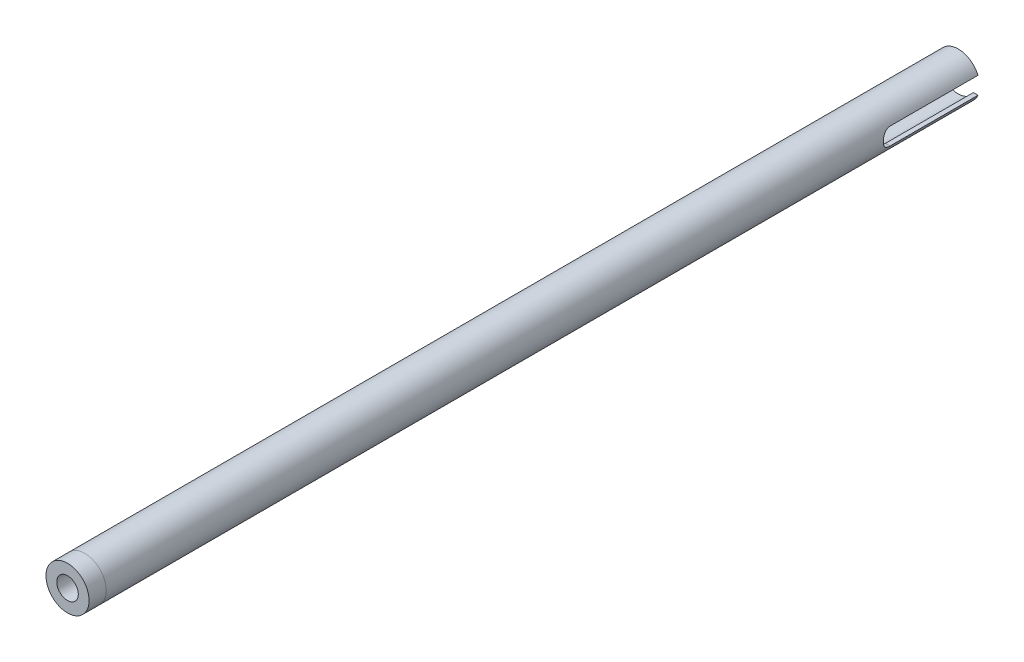
ISO-10303-21;
HEADER;
FILE_DESCRIPTION(('STEP AP214'),'2;1');
FILE_NAME('part.step','',(''),(''),'','','');
FILE_SCHEMA(('AUTOMOTIVE_DESIGN { 1 0 10303 214 1 1 1 1 }'));
ENDSEC;
DATA;
#1=APPLICATION_CONTEXT('core data for automotive mechanical design processes');
#2=APPLICATION_PROTOCOL_DEFINITION('international standard','automotive_design',2000,#1);
#3=PRODUCT_CONTEXT('',#1,'mechanical');
#4=PRODUCT('Part','Part','',(#3));
#5=PRODUCT_RELATED_PRODUCT_CATEGORY('part','',(#4));
#6=PRODUCT_DEFINITION_FORMATION('','',#4);
#7=PRODUCT_DEFINITION_CONTEXT('part definition',#1,'design');
#8=PRODUCT_DEFINITION('design','',#6,#7);
#9=PRODUCT_DEFINITION_SHAPE('','',#8);
#10=(LENGTH_UNIT() NAMED_UNIT(*) SI_UNIT(.MILLI.,.METRE.));
#11=(NAMED_UNIT(*) PLANE_ANGLE_UNIT() SI_UNIT($,.RADIAN.));
#12=(NAMED_UNIT(*) SI_UNIT($,.STERADIAN.) SOLID_ANGLE_UNIT());
#13=UNCERTAINTY_MEASURE_WITH_UNIT(LENGTH_MEASURE(1.E-05),#10,'distance_accuracy_value','');
#14=(GEOMETRIC_REPRESENTATION_CONTEXT(3) GLOBAL_UNCERTAINTY_ASSIGNED_CONTEXT((#13)) GLOBAL_UNIT_ASSIGNED_CONTEXT((#10,
#11,#12)) REPRESENTATION_CONTEXT('',''));
#15=CARTESIAN_POINT('',(0.,0.,0.));
#16=DIRECTION('',(0.,0.,1.));
#17=DIRECTION('',(1.,0.,0.));
#18=AXIS2_PLACEMENT_3D('',#15,#16,#17);
#19=CARTESIAN_POINT('',(0.,0.,-328.070249741068));
#20=DIRECTION('',(0.,0.,1.));
#21=DIRECTION('',(1.,0.,0.));
#22=AXIS2_PLACEMENT_3D('',#19,#20,#21);
#23=CYLINDRICAL_SURFACE('',#22,7.9375);
#24=CARTESIAN_POINT('',(0.,0.,-6.35));
#25=DIRECTION('',(0.,0.,1.));
#26=DIRECTION('',(1.,0.,0.));
#27=AXIS2_PLACEMENT_3D('',#24,#25,#26);
#28=CIRCLE('',#27,7.9375);
#29=CARTESIAN_POINT('',(7.9375,0.,-6.35));
#30=VERTEX_POINT('',#29);
#31=EDGE_CURVE('E167',#30,#30,#28,.T.);
#32=ORIENTED_EDGE('',*,*,#31,.F.);
#33=EDGE_LOOP('',(#32));
#34=FACE_BOUND('',#33,.T.);
#35=CARTESIAN_POINT('',(-7.2748389157424,3.175,-295.685249741068));
#36=CARTESIAN_POINT('',(-7.27482137043434,3.17501267173453,-295.599829625585));
#37=CARTESIAN_POINT('',(-7.27634297592672,3.17155313247793,-295.514419096022));
#38=CARTESIAN_POINT('',(-7.28233338484875,3.15778866907725,-295.344287091694));
#39=CARTESIAN_POINT('',(-7.28680106535325,3.14748635311323,-295.259565366835));
#40=CARTESIAN_POINT('',(-7.2985291631267,3.12019002880163,-295.091751667027));
#41=CARTESIAN_POINT('',(-7.30577831906487,3.10322299732752,-295.008654522267));
#42=CARTESIAN_POINT('',(-7.32282161153744,3.06278779397035,-294.844343420242));
#43=CARTESIAN_POINT('',(-7.33261590324725,3.03931922568674,-294.763129578129));
#44=CARTESIAN_POINT('',(-7.36535331460444,2.95952924342962,-294.523304755546));
#45=CARTESIAN_POINT('',(-7.39167595677839,2.89376893609239,-294.368179826742));
#46=CARTESIAN_POINT('',(-7.45033259991547,2.73920602658923,-294.071092400031));
#47=CARTESIAN_POINT('',(-7.48267254395243,2.65038060922872,-293.929143124813));
#48=CARTESIAN_POINT('',(-7.55175295441387,2.44684429809694,-293.654422355294));
#49=CARTESIAN_POINT('',(-7.58863404630155,2.33103943595687,-293.522494970782));
#50=CARTESIAN_POINT('',(-7.66147718953598,2.07914562663533,-293.27933208715));
#51=CARTESIAN_POINT('',(-7.69743902899202,1.94305205135846,-293.168101322222));
#52=CARTESIAN_POINT('',(-7.76611692840651,1.64778282664419,-292.965180122727));
#53=CARTESIAN_POINT('',(-7.79864638434712,1.48790317306356,-292.874445711323));
#54=CARTESIAN_POINT('',(-7.85502980346525,1.15369615984563,-292.721588157906));
#55=CARTESIAN_POINT('',(-7.87889360585224,0.979385463602722,-292.659432545288));
#56=CARTESIAN_POINT('',(-7.91022225039827,0.670405323433354,-292.578920901632));
#57=CARTESIAN_POINT('',(-7.92038443902171,0.537888188660439,-292.553242978223));
#58=CARTESIAN_POINT('',(-7.93061686811603,0.337231082382107,-292.527487895141));
#59=CARTESIAN_POINT('',(-7.93319257341971,0.269991647180298,-292.52102979786));
#60=CARTESIAN_POINT('',(-7.93663621925193,0.135173873369596,-292.512408780109));
#61=CARTESIAN_POINT('',(-7.93750363389236,0.0675954368175869,-292.51024718229));
#62=CARTESIAN_POINT('',(-7.9375,0.,-292.510249741068));
#63=B_SPLINE_CURVE_WITH_KNOTS('',3,(#35,#36,#37,#38,#39,#40,#41,#42,#43,#44,#45,#46,#47,#48,#49,
#50,#51,#52,#53,#54,#55,#56,#57,#58,#59,#60,#61,#62),.UNSPECIFIED.,.F.,.F.,(4,2,2,2,2,2,2,2,2,2,
2,2,2,4),(0.,0.256160797396612,0.512224013007058,0.767261264672238,1.02231406945471,
1.53142416248594,2.04103978047897,2.57679273649405,3.11266809162683,3.66991136029742,
4.22651992730645,4.63134321412666,4.8339937586662,5.03670667834028),.UNSPECIFIED.);
#64=CARTESIAN_POINT('',(-7.2748389157424,3.175,-295.685249741068));
#65=VERTEX_POINT('',#64);
#66=CARTESIAN_POINT('',(-7.9375,0.,-292.510249741068));
#67=VERTEX_POINT('',#66);
#68=EDGE_CURVE('E194',#65,#67,#63,.T.);
#69=ORIENTED_EDGE('',*,*,#68,.T.);
#70=CARTESIAN_POINT('',(-7.9375,0.,-292.510249741068));
#71=CARTESIAN_POINT('',(-7.93751279435796,-0.0856973243893185,-292.510237710899));
#72=CARTESIAN_POINT('',(-7.93611246860092,-0.171386675169291,-292.513719078371));
#73=CARTESIAN_POINT('',(-7.93058107051394,-0.342092796869088,-292.527575173705));
#74=CARTESIAN_POINT('',(-7.92645080745519,-0.427109759557717,-292.537947858688));
#75=CARTESIAN_POINT('',(-7.91557399086504,-0.595570690948319,-292.565445052756));
#76=CARTESIAN_POINT('',(-7.90883664469869,-0.67901912358001,-292.582545804029));
#77=CARTESIAN_POINT('',(-7.89293284658536,-0.844038966454646,-292.623313051502));
#78=CARTESIAN_POINT('',(-7.88376629739099,-0.925610301410303,-292.646979810559));
#79=CARTESIAN_POINT('',(-7.85297007832481,-1.16656173687588,-292.727487466257));
#80=CARTESIAN_POINT('',(-7.82802544143958,-1.32244720282989,-292.793880099135));
#81=CARTESIAN_POINT('',(-7.77174407779742,-1.62081902572888,-292.949925503128));
#82=CARTESIAN_POINT('',(-7.74040257287306,-1.7632952496653,-293.039595675191));
#83=CARTESIAN_POINT('',(-7.67287736621953,-2.03755465224644,-293.244049282706));
#84=CARTESIAN_POINT('',(-7.63654472176442,-2.16862853615059,-293.359736139438));
#85=CARTESIAN_POINT('',(-7.56380976030912,-2.41011022612819,-293.611030241147));
#86=CARTESIAN_POINT('',(-7.52740741976911,-2.52050895891189,-293.746646185629));
#87=CARTESIAN_POINT('',(-7.45683282624284,-2.72240939900242,-294.041344680495));
#88=CARTESIAN_POINT('',(-7.4228346735038,-2.81283701743189,-294.201208670411));
#89=CARTESIAN_POINT('',(-7.3633362219632,-2.96511894168388,-294.535334635207));
#90=CARTESIAN_POINT('',(-7.33782422493328,-3.02701262758154,-294.709576372966));
#91=CARTESIAN_POINT('',(-7.30424985403508,-3.10695047193342,-295.017880097617));
#92=CARTESIAN_POINT('',(-7.29331360019113,-3.13238569878909,-295.149738858504));
#93=CARTESIAN_POINT('',(-7.28227977674291,-3.15790858319001,-295.349455740198));
#94=CARTESIAN_POINT('',(-7.27949685702346,-3.16431127275807,-295.416404030957));
#95=CARTESIAN_POINT('',(-7.27577355567174,-3.17285909036155,-295.550645588823));
#96=CARTESIAN_POINT('',(-7.27483380475762,-3.1750027609968,-295.617938966121));
#97=CARTESIAN_POINT('',(-7.2748389157424,-3.175,-295.685249741068));
#98=B_SPLINE_CURVE_WITH_KNOTS('',3,(#70,#71,#72,#73,#74,#75,#76,#77,#78,#79,#80,#81,#82,#83,#84,
#85,#86,#87,#88,#89,#90,#91,#92,#93,#94,#95,#96,#97),.UNSPECIFIED.,.F.,.F.,(4,2,2,2,2,2,2,2,2,2,
2,2,2,4),(0.,0.256996432008007,0.513916713336978,0.769937797705386,1.02596913282157,
1.53722547809954,2.04886511530059,2.58219314099272,3.11575467201799,3.67332953074261,
4.2301325519037,4.63306130520181,4.83485003827446,5.03670780985612),.UNSPECIFIED.);
#99=CARTESIAN_POINT('',(-7.2748389157424,-3.175,-295.685249741068));
#100=VERTEX_POINT('',#99);
#101=EDGE_CURVE('E146',#67,#100,#98,.T.);
#102=ORIENTED_EDGE('',*,*,#101,.T.);
#103=DIRECTION('',(0.,0.,-1.));
#104=VECTOR('',#103,1.);
#105=CARTESIAN_POINT('',(-7.2748389157424,-3.175,-292.510249741068));
#106=LINE('',#105,#104);
#107=CARTESIAN_POINT('',(-7.2748389157424,-3.175,-328.070249741068));
#108=VERTEX_POINT('',#107);
#109=EDGE_CURVE('E141',#100,#108,#106,.T.);
#110=ORIENTED_EDGE('',*,*,#109,.T.);
#111=CARTESIAN_POINT('',(0.,0.,-328.070249741068));
#112=DIRECTION('',(0.,0.,1.));
#113=DIRECTION('',(1.,0.,0.));
#114=AXIS2_PLACEMENT_3D('',#111,#112,#113);
#115=CIRCLE('',#114,7.9375);
#116=CARTESIAN_POINT('',(7.2748389157424,-3.175,-328.070249741068));
#117=VERTEX_POINT('',#116);
#118=EDGE_CURVE('E144',#108,#117,#115,.T.);
#119=ORIENTED_EDGE('',*,*,#118,.T.);
#120=DIRECTION('',(0.,0.,-1.));
#121=VECTOR('',#120,1.);
#122=CARTESIAN_POINT('',(7.2748389157424,-3.175,-292.510249741068));
#123=LINE('',#122,#121);
#124=CARTESIAN_POINT('',(7.2748389157424,-3.175,-295.685249741068));
#125=VERTEX_POINT('',#124);
#126=EDGE_CURVE('E427',#125,#117,#123,.T.);
#127=ORIENTED_EDGE('',*,*,#126,.F.);
#128=CARTESIAN_POINT('',(7.2748389157424,-3.175,-295.685249741068));
#129=CARTESIAN_POINT('',(7.27482137043434,-3.17501267173453,-295.599829625585));
#130=CARTESIAN_POINT('',(7.27634297592672,-3.17155313247793,-295.514419096022));
#131=CARTESIAN_POINT('',(7.28233338484875,-3.15778866907725,-295.344287091694));
#132=CARTESIAN_POINT('',(7.28680106535325,-3.14748635311323,-295.259565366835));
#133=CARTESIAN_POINT('',(7.2985291631267,-3.12019002880163,-295.091751667027));
#134=CARTESIAN_POINT('',(7.30577831906487,-3.10322299732752,-295.008654522267));
#135=CARTESIAN_POINT('',(7.32282161153744,-3.06278779397035,-294.844343420242));
#136=CARTESIAN_POINT('',(7.33261590324725,-3.03931922568674,-294.763129578129));
#137=CARTESIAN_POINT('',(7.36535331460444,-2.95952924342962,-294.523304755546));
#138=CARTESIAN_POINT('',(7.39167595677839,-2.89376893609239,-294.368179826742));
#139=CARTESIAN_POINT('',(7.45033259991547,-2.73920602658923,-294.071092400031));
#140=CARTESIAN_POINT('',(7.48267254395243,-2.65038060922872,-293.929143124813));
#141=CARTESIAN_POINT('',(7.55175295441387,-2.44684429809694,-293.654422355294));
#142=CARTESIAN_POINT('',(7.58863404630155,-2.33103943595687,-293.522494970782));
#143=CARTESIAN_POINT('',(7.66147718953598,-2.07914562663533,-293.27933208715));
#144=CARTESIAN_POINT('',(7.69743902899202,-1.94305205135846,-293.168101322222));
#145=CARTESIAN_POINT('',(7.76611692840651,-1.64778282664419,-292.965180122727));
#146=CARTESIAN_POINT('',(7.79864638434712,-1.48790317306356,-292.874445711323));
#147=CARTESIAN_POINT('',(7.85502980346525,-1.15369615984563,-292.721588157906));
#148=CARTESIAN_POINT('',(7.87889360585224,-0.979385463602722,-292.659432545288));
#149=CARTESIAN_POINT('',(7.91022225039827,-0.670405323433354,-292.578920901632));
#150=CARTESIAN_POINT('',(7.92038443902171,-0.537888188660439,-292.553242978223));
#151=CARTESIAN_POINT('',(7.93061686811603,-0.337231082382107,-292.527487895141));
#152=CARTESIAN_POINT('',(7.93319257341971,-0.269991647180298,-292.52102979786));
#153=CARTESIAN_POINT('',(7.93663621925193,-0.135173873369596,-292.512408780109));
#154=CARTESIAN_POINT('',(7.93750363389236,-0.0675954368175869,-292.51024718229));
#155=CARTESIAN_POINT('',(7.9375,0.,-292.510249741068));
#156=B_SPLINE_CURVE_WITH_KNOTS('',3,(#128,#129,#130,#131,#132,#133,#134,#135,#136,#137,#138,
#139,#140,#141,#142,#143,#144,#145,#146,#147,#148,#149,#150,#151,#152,#153,#154,#155),
.UNSPECIFIED.,.F.,.F.,(4,2,2,2,2,2,2,2,2,2,2,2,2,4),(0.,0.256160797396612,0.512224013007058,
0.767261264672238,1.02231406945471,1.53142416248594,2.04103978047897,2.57679273649405,
3.11266809162683,3.66991136029742,4.22651992730645,4.63134321412666,4.8339937586662,
5.03670667834028),.UNSPECIFIED.);
#157=CARTESIAN_POINT('',(7.9375,0.,-292.510249741068));
#158=VERTEX_POINT('',#157);
#159=EDGE_CURVE('E87',#125,#158,#156,.T.);
#160=ORIENTED_EDGE('',*,*,#159,.T.);
#161=CARTESIAN_POINT('',(7.9375,0.,-292.510249741068));
#162=CARTESIAN_POINT('',(7.93751279435796,0.0856973243893185,-292.510237710899));
#163=CARTESIAN_POINT('',(7.93611246860092,0.171386675169291,-292.513719078371));
#164=CARTESIAN_POINT('',(7.93058107051394,0.342092796869088,-292.527575173705));
#165=CARTESIAN_POINT('',(7.92645080745519,0.427109759557717,-292.537947858688));
#166=CARTESIAN_POINT('',(7.91557399086504,0.595570690948319,-292.565445052756));
#167=CARTESIAN_POINT('',(7.90883664469869,0.67901912358001,-292.582545804029));
#168=CARTESIAN_POINT('',(7.89293284658536,0.844038966454646,-292.623313051502));
#169=CARTESIAN_POINT('',(7.88376629739099,0.925610301410303,-292.646979810559));
#170=CARTESIAN_POINT('',(7.85297007832481,1.16656173687588,-292.727487466257));
#171=CARTESIAN_POINT('',(7.82802544143958,1.32244720282989,-292.793880099135));
#172=CARTESIAN_POINT('',(7.77174407779742,1.62081902572888,-292.949925503128));
#173=CARTESIAN_POINT('',(7.74040257287306,1.7632952496653,-293.039595675191));
#174=CARTESIAN_POINT('',(7.67287736621953,2.03755465224644,-293.244049282706));
#175=CARTESIAN_POINT('',(7.63654472176442,2.16862853615059,-293.359736139438));
#176=CARTESIAN_POINT('',(7.56380976030912,2.41011022612819,-293.611030241147));
#177=CARTESIAN_POINT('',(7.52740741976911,2.52050895891189,-293.746646185629));
#178=CARTESIAN_POINT('',(7.45683282624284,2.72240939900242,-294.041344680495));
#179=CARTESIAN_POINT('',(7.4228346735038,2.81283701743189,-294.201208670411));
#180=CARTESIAN_POINT('',(7.3633362219632,2.96511894168388,-294.535334635207));
#181=CARTESIAN_POINT('',(7.33782422493328,3.02701262758154,-294.709576372966));
#182=CARTESIAN_POINT('',(7.30424985403508,3.10695047193342,-295.017880097617));
#183=CARTESIAN_POINT('',(7.29331360019113,3.13238569878909,-295.149738858504));
#184=CARTESIAN_POINT('',(7.28227977674291,3.15790858319001,-295.349455740198));
#185=CARTESIAN_POINT('',(7.27949685702346,3.16431127275807,-295.416404030957));
#186=CARTESIAN_POINT('',(7.27577355567174,3.17285909036155,-295.550645588823));
#187=CARTESIAN_POINT('',(7.27483380475762,3.1750027609968,-295.617938966121));
#188=CARTESIAN_POINT('',(7.2748389157424,3.175,-295.685249741068));
#189=B_SPLINE_CURVE_WITH_KNOTS('',3,(#161,#162,#163,#164,#165,#166,#167,#168,#169,#170,#171,
#172,#173,#174,#175,#176,#177,#178,#179,#180,#181,#182,#183,#184,#185,#186,#187,#188),
.UNSPECIFIED.,.F.,.F.,(4,2,2,2,2,2,2,2,2,2,2,2,2,4),(0.,0.256996432008007,0.513916713336978,
0.769937797705386,1.02596913282157,1.53722547809954,2.04886511530059,2.58219314099272,
3.11575467201799,3.67332953074261,4.2301325519037,4.63306130520181,4.83485003827446,
5.03670780985612),.UNSPECIFIED.);
#190=CARTESIAN_POINT('',(7.2748389157424,3.175,-295.685249741068));
#191=VERTEX_POINT('',#190);
#192=EDGE_CURVE('E73',#158,#191,#189,.T.);
#193=ORIENTED_EDGE('',*,*,#192,.T.);
#194=DIRECTION('',(0.,0.,-1.));
#195=VECTOR('',#194,1.);
#196=CARTESIAN_POINT('',(7.2748389157424,3.175,-292.510249741068));
#197=LINE('',#196,#195);
#198=CARTESIAN_POINT('',(7.2748389157424,3.175,-328.070249741068));
#199=VERTEX_POINT('',#198);
#200=EDGE_CURVE('E160',#191,#199,#197,.T.);
#201=ORIENTED_EDGE('',*,*,#200,.T.);
#202=CARTESIAN_POINT('',(-7.2748389157424,3.175,-328.070249741068));
#203=VERTEX_POINT('',#202);
#204=EDGE_CURVE('E166',#199,#203,#115,.T.);
#205=ORIENTED_EDGE('',*,*,#204,.T.);
#206=DIRECTION('',(0.,0.,-1.));
#207=VECTOR('',#206,1.);
#208=CARTESIAN_POINT('',(-7.2748389157424,3.175,-292.510249741068));
#209=LINE('',#208,#207);
#210=EDGE_CURVE('E420',#65,#203,#209,.T.);
#211=ORIENTED_EDGE('',*,*,#210,.F.);
#212=EDGE_LOOP('',(#69,#102,#110,#119,#127,#160,#193,#201,#205,#211));
#213=FACE_BOUND('',#212,.T.);
#214=ADVANCED_FACE('F63',(#34,#213),#23,.T.);
#215=CARTESIAN_POINT('',(0.,0.,-328.070249741068));
#216=DIRECTION('',(0.,0.,1.));
#217=DIRECTION('',(1.,0.,0.));
#218=AXIS2_PLACEMENT_3D('',#215,#216,#217);
#219=PLANE('',#218);
#220=DIRECTION('',(1.,0.,0.));
#221=VECTOR('',#220,1.);
#222=CARTESIAN_POINT('',(0.,-3.175,-328.070249741068));
#223=LINE('',#222,#221);
#224=CARTESIAN_POINT('',(-5.57246419907746,-3.175,-328.070249741068));
#225=VERTEX_POINT('',#224);
#226=EDGE_CURVE('E153',#108,#225,#223,.T.);
#227=ORIENTED_EDGE('',*,*,#226,.T.);
#228=CARTESIAN_POINT('',(0.,0.,-328.070249741068));
#229=DIRECTION('',(0.,0.,1.));
#230=DIRECTION('',(1.,0.,0.));
#231=AXIS2_PLACEMENT_3D('',#228,#229,#230);
#232=CIRCLE('',#231,6.4135);
#233=CARTESIAN_POINT('',(5.57246419907746,-3.175,-328.070249741068));
#234=VERTEX_POINT('',#233);
#235=EDGE_CURVE('E275',#225,#234,#232,.T.);
#236=ORIENTED_EDGE('',*,*,#235,.T.);
#237=DIRECTION('',(1.,0.,0.));
#238=VECTOR('',#237,1.);
#239=CARTESIAN_POINT('',(0.,-3.175,-328.070249741068));
#240=LINE('',#239,#238);
#241=EDGE_CURVE('E165',#234,#117,#240,.T.);
#242=ORIENTED_EDGE('',*,*,#241,.T.);
#243=ORIENTED_EDGE('',*,*,#118,.F.);
#244=EDGE_LOOP('',(#227,#236,#242,#243));
#245=FACE_BOUND('',#244,.T.);
#246=ADVANCED_FACE('F163',(#245),#219,.F.);
#247=CARTESIAN_POINT('',(0.,0.,-328.070249741068));
#248=DIRECTION('',(0.,0.,1.));
#249=DIRECTION('',(1.,0.,0.));
#250=AXIS2_PLACEMENT_3D('',#247,#248,#249);
#251=CYLINDRICAL_SURFACE('',#250,6.4135);
#252=CARTESIAN_POINT('',(0.,0.,-6.35));
#253=DIRECTION('',(0.,0.,1.));
#254=DIRECTION('',(1.,0.,0.));
#255=AXIS2_PLACEMENT_3D('',#252,#253,#254);
#256=CIRCLE('',#255,6.4135);
#257=CARTESIAN_POINT('',(6.4135,0.,-6.35));
#258=VERTEX_POINT('',#257);
#259=EDGE_CURVE('E149',#258,#258,#256,.T.);
#260=ORIENTED_EDGE('',*,*,#259,.T.);
#261=EDGE_LOOP('',(#260));
#262=FACE_BOUND('',#261,.T.);
#263=DIRECTION('',(0.,0.,-1.));
#264=VECTOR('',#263,1.);
#265=CARTESIAN_POINT('',(-5.57246419907746,-3.175,-292.510249741068));
#266=LINE('',#265,#264);
#267=CARTESIAN_POINT('',(-5.57246419907746,-3.175,-295.685249741068));
#268=VERTEX_POINT('',#267);
#269=EDGE_CURVE('E150',#268,#225,#266,.T.);
#270=ORIENTED_EDGE('',*,*,#269,.F.);
#271=CARTESIAN_POINT('',(-5.57246419907746,-3.175,-295.685249741068));
#272=CARTESIAN_POINT('',(-5.57244013006406,-3.17501485930532,-295.601970628029));
#273=CARTESIAN_POINT('',(-5.57433046393327,-3.17172393593588,-295.518704861159));
#274=CARTESIAN_POINT('',(-5.58175879139227,-3.15864741746939,-295.352897276347));
#275=CARTESIAN_POINT('',(-5.58729459414879,-3.14886572313217,-295.270355053746));
#276=CARTESIAN_POINT('',(-5.60179156831922,-3.12299843383605,-295.107058247017));
#277=CARTESIAN_POINT('',(-5.61073298145,-3.10694918790095,-295.026296142103));
#278=CARTESIAN_POINT('',(-5.63171276239417,-3.06875665913499,-294.866652226602));
#279=CARTESIAN_POINT('',(-5.64375147558632,-3.04661269666535,-294.787770626782));
#280=CARTESIAN_POINT('',(-5.6838799338154,-2.97148657354666,-294.555037451783));
#281=CARTESIAN_POINT('',(-5.71602843451584,-2.90973243042152,-294.404616954545));
#282=CARTESIAN_POINT('',(-5.78746445334561,-2.76491119647661,-294.116159737717));
#283=CARTESIAN_POINT('',(-5.8267630725243,-2.68181088046089,-293.97814278035));
#284=CARTESIAN_POINT('',(-5.91189137020974,-2.48887418737119,-293.706345696322));
#285=CARTESIAN_POINT('',(-5.95799203211627,-2.37743022169016,-293.573788893871));
#286=CARTESIAN_POINT('',(-6.04933625068999,-2.13433179626949,-293.328321224798));
#287=CARTESIAN_POINT('',(-6.09457954365871,-2.00267122837297,-293.215416317785));
#288=CARTESIAN_POINT('',(-6.18270630442022,-1.71220053093684,-293.005097025333));
#289=CARTESIAN_POINT('',(-6.22523407848511,-1.55216870534977,-292.909207274902));
#290=CARTESIAN_POINT('',(-6.29953728626817,-1.21586879246633,-292.746358378585));
#291=CARTESIAN_POINT('',(-6.33132906884324,-1.03962591706377,-292.679355200542));
#292=CARTESIAN_POINT('',(-6.37455801221378,-0.719418942476251,-292.589483368211));
#293=CARTESIAN_POINT('',(-6.38903678436651,-0.577736145507957,-292.559910653847));
#294=CARTESIAN_POINT('',(-6.40364692368403,-0.362616983152034,-292.530189579532));
#295=CARTESIAN_POINT('',(-6.40733246196224,-0.290370591494075,-292.522722066895));
#296=CARTESIAN_POINT('',(-6.41226237468065,-0.145424356491903,-292.512749177957));
#297=CARTESIAN_POINT('',(-6.41350576158006,-0.0727243416303698,-292.51024580902));
#298=CARTESIAN_POINT('',(-6.4135,0.,-292.510249741068));
#299=B_SPLINE_CURVE_WITH_KNOTS('',3,(#271,#272,#273,#274,#275,#276,#277,#278,#279,#280,#281,
#282,#283,#284,#285,#286,#287,#288,#289,#290,#291,#292,#293,#294,#295,#296,#297,#298),
.UNSPECIFIED.,.F.,.F.,(4,2,2,2,2,2,2,2,2,2,2,2,2,4),(0.,0.249729002226608,0.499308060527582,
0.747460667546715,0.995640957972498,1.49055300136654,1.98624009021394,2.52160227908797,
3.05712653941521,3.62817923327589,4.19835836008502,4.63305000595099,4.85103401853339,
5.06910615989469),.UNSPECIFIED.);
#300=CARTESIAN_POINT('',(-6.4135,0.,-292.510249741068));
#301=VERTEX_POINT('',#300);
#302=EDGE_CURVE('E221',#268,#301,#299,.T.);
#303=ORIENTED_EDGE('',*,*,#302,.T.);
#304=CARTESIAN_POINT('',(-6.4135,0.,-292.510249741068));
#305=CARTESIAN_POINT('',(-6.41351478956105,0.0839162873638195,-292.510236341171));
#306=CARTESIAN_POINT('',(-6.41185341043851,0.167823114288182,-292.513576267219));
#307=CARTESIAN_POINT('',(-6.40528923860734,0.33495253632637,-292.526858707824));
#308=CARTESIAN_POINT('',(-6.40038773102953,0.418175389480093,-292.536798604644));
#309=CARTESIAN_POINT('',(-6.38748331817869,0.58296549878522,-292.563117409162));
#310=CARTESIAN_POINT('',(-6.37949454331383,0.664538541389253,-292.579466984651));
#311=CARTESIAN_POINT('',(-6.36062930478242,0.825821595252368,-292.618405288244));
#312=CARTESIAN_POINT('',(-6.34975266552956,0.905531492908811,-292.640994395725));
#313=CARTESIAN_POINT('',(-6.31319792977548,1.14087800407252,-292.717730958485));
#314=CARTESIAN_POINT('',(-6.28356695572383,1.29306927815055,-292.780902606673));
#315=CARTESIAN_POINT('',(-6.21648032622801,1.58455945770353,-292.929053348652));
#316=CARTESIAN_POINT('',(-6.17901685649499,1.72384528592309,-293.014054240432));
#317=CARTESIAN_POINT('',(-6.09713913910647,1.99475482128856,-293.209154378683));
#318=CARTESIAN_POINT('',(-6.05244508581476,2.12544046453043,-293.320439255422));
#319=CARTESIAN_POINT('',(-5.96206469267669,2.36716277188881,-293.562408701587));
#320=CARTESIAN_POINT('',(-5.9163776032387,2.47818397002904,-293.693108393427));
#321=CARTESIAN_POINT('',(-5.82517699615972,2.68591268931947,-293.982154222378));
#322=CARTESIAN_POINT('',(-5.77994318763785,2.78087960507694,-294.141849416959));
#323=CARTESIAN_POINT('',(-5.69959190124919,2.9420744279085,-294.47723269414));
#324=CARTESIAN_POINT('',(-5.66445328320705,3.00836254036259,-294.652886327312));
#325=CARTESIAN_POINT('',(-5.61637168534323,3.09697219420915,-294.971337701706));
#326=CARTESIAN_POINT('',(-5.60011055849822,3.1260622343607,-295.111752304365));
#327=CARTESIAN_POINT('',(-5.58363385282995,3.15533369889112,-295.325129182608));
#328=CARTESIAN_POINT('',(-5.57946041232981,3.16269716900745,-295.39686090749));
#329=CARTESIAN_POINT('',(-5.57386984218861,3.17253394278506,-295.540802847532));
#330=CARTESIAN_POINT('',(-5.57245416126573,3.17500467618403,-295.613013294204));
#331=CARTESIAN_POINT('',(-5.57246419907746,3.175,-295.685249741068));
#332=B_SPLINE_CURVE_WITH_KNOTS('',3,(#304,#305,#306,#307,#308,#309,#310,#311,#312,#313,#314,
#315,#316,#317,#318,#319,#320,#321,#322,#323,#324,#325,#326,#327,#328,#329,#330,#331),
.UNSPECIFIED.,.F.,.F.,(4,2,2,2,2,2,2,2,2,2,2,2,2,4),(0.,0.251650249697328,0.503200747298848,
0.75361328099314,1.00404104361821,1.50387930503274,2.00421864304453,2.53410176460237,
3.06439980342596,3.63519589642624,4.20478783377489,4.63602373673194,4.85251353275904,
5.06911702550462),.UNSPECIFIED.);
#333=CARTESIAN_POINT('',(-5.57246419907746,3.175,-295.685249741068));
#334=VERTEX_POINT('',#333);
#335=EDGE_CURVE('E186',#301,#334,#332,.T.);
#336=ORIENTED_EDGE('',*,*,#335,.T.);
#337=DIRECTION('',(0.,0.,-1.));
#338=VECTOR('',#337,1.);
#339=CARTESIAN_POINT('',(-5.57246419907746,3.175,-292.510249741068));
#340=LINE('',#339,#338);
#341=CARTESIAN_POINT('',(-5.57246419907746,3.175,-328.070249741068));
#342=VERTEX_POINT('',#341);
#343=EDGE_CURVE('E417',#334,#342,#340,.T.);
#344=ORIENTED_EDGE('',*,*,#343,.T.);
#345=CARTESIAN_POINT('',(5.57246419907746,3.175,-328.070249741068));
#346=VERTEX_POINT('',#345);
#347=EDGE_CURVE('E172',#346,#342,#232,.T.);
#348=ORIENTED_EDGE('',*,*,#347,.F.);
#349=DIRECTION('',(0.,0.,-1.));
#350=VECTOR('',#349,1.);
#351=CARTESIAN_POINT('',(5.57246419907746,3.175,-292.510249741068));
#352=LINE('',#351,#350);
#353=CARTESIAN_POINT('',(5.57246419907746,3.175,-295.685249741068));
#354=VERTEX_POINT('',#353);
#355=EDGE_CURVE('E269',#354,#346,#352,.T.);
#356=ORIENTED_EDGE('',*,*,#355,.F.);
#357=CARTESIAN_POINT('',(5.57246419907746,3.175,-295.685249741068));
#358=CARTESIAN_POINT('',(5.57244013006406,3.17501485930532,-295.601970628029));
#359=CARTESIAN_POINT('',(5.57433046393327,3.17172393593588,-295.518704861159));
#360=CARTESIAN_POINT('',(5.58175879139227,3.15864741746939,-295.352897276347));
#361=CARTESIAN_POINT('',(5.58729459414879,3.14886572313217,-295.270355053746));
#362=CARTESIAN_POINT('',(5.60179156831922,3.12299843383605,-295.107058247017));
#363=CARTESIAN_POINT('',(5.61073298145,3.10694918790095,-295.026296142103));
#364=CARTESIAN_POINT('',(5.63171276239417,3.06875665913499,-294.866652226602));
#365=CARTESIAN_POINT('',(5.64375147558632,3.04661269666535,-294.787770626782));
#366=CARTESIAN_POINT('',(5.6838799338154,2.97148657354666,-294.555037451783));
#367=CARTESIAN_POINT('',(5.71602843451584,2.90973243042152,-294.404616954545));
#368=CARTESIAN_POINT('',(5.78746445334561,2.76491119647661,-294.116159737717));
#369=CARTESIAN_POINT('',(5.8267630725243,2.68181088046089,-293.97814278035));
#370=CARTESIAN_POINT('',(5.91189137020974,2.48887418737119,-293.706345696322));
#371=CARTESIAN_POINT('',(5.95799203211627,2.37743022169016,-293.573788893871));
#372=CARTESIAN_POINT('',(6.04933625068999,2.13433179626949,-293.328321224798));
#373=CARTESIAN_POINT('',(6.09457954365871,2.00267122837297,-293.215416317785));
#374=CARTESIAN_POINT('',(6.18270630442022,1.71220053093684,-293.005097025333));
#375=CARTESIAN_POINT('',(6.22523407848511,1.55216870534977,-292.909207274902));
#376=CARTESIAN_POINT('',(6.29953728626817,1.21586879246633,-292.746358378585));
#377=CARTESIAN_POINT('',(6.33132906884324,1.03962591706377,-292.679355200542));
#378=CARTESIAN_POINT('',(6.37455801221378,0.719418942476251,-292.589483368211));
#379=CARTESIAN_POINT('',(6.38903678436651,0.577736145507957,-292.559910653847));
#380=CARTESIAN_POINT('',(6.40364692368403,0.362616983152034,-292.530189579532));
#381=CARTESIAN_POINT('',(6.40733246196224,0.290370591494075,-292.522722066895));
#382=CARTESIAN_POINT('',(6.41226237468065,0.145424356491903,-292.512749177957));
#383=CARTESIAN_POINT('',(6.41350576158006,0.0727243416303698,-292.51024580902));
#384=CARTESIAN_POINT('',(6.4135,0.,-292.510249741068));
#385=B_SPLINE_CURVE_WITH_KNOTS('',3,(#357,#358,#359,#360,#361,#362,#363,#364,#365,#366,#367,
#368,#369,#370,#371,#372,#373,#374,#375,#376,#377,#378,#379,#380,#381,#382,#383,#384),
.UNSPECIFIED.,.F.,.F.,(4,2,2,2,2,2,2,2,2,2,2,2,2,4),(0.,0.249729002226608,0.499308060527582,
0.747460667546715,0.995640957972498,1.49055300136654,1.98624009021394,2.52160227908797,
3.05712653941521,3.62817923327589,4.19835836008502,4.63305000595099,4.85103401853339,
5.06910615989469),.UNSPECIFIED.);
#386=CARTESIAN_POINT('',(6.4135,0.,-292.510249741068));
#387=VERTEX_POINT('',#386);
#388=EDGE_CURVE('E13',#354,#387,#385,.T.);
#389=ORIENTED_EDGE('',*,*,#388,.T.);
#390=CARTESIAN_POINT('',(6.4135,0.,-292.510249741068));
#391=CARTESIAN_POINT('',(6.41351478956105,-0.0839162873638195,-292.510236341171));
#392=CARTESIAN_POINT('',(6.41185341043851,-0.167823114288182,-292.513576267219));
#393=CARTESIAN_POINT('',(6.40528923860734,-0.33495253632637,-292.526858707824));
#394=CARTESIAN_POINT('',(6.40038773102953,-0.418175389480093,-292.536798604644));
#395=CARTESIAN_POINT('',(6.38748331817869,-0.58296549878522,-292.563117409162));
#396=CARTESIAN_POINT('',(6.37949454331383,-0.664538541389253,-292.579466984651));
#397=CARTESIAN_POINT('',(6.36062930478242,-0.825821595252368,-292.618405288244));
#398=CARTESIAN_POINT('',(6.34975266552956,-0.905531492908811,-292.640994395725));
#399=CARTESIAN_POINT('',(6.31319792977548,-1.14087800407252,-292.717730958485));
#400=CARTESIAN_POINT('',(6.28356695572383,-1.29306927815055,-292.780902606673));
#401=CARTESIAN_POINT('',(6.21648032622801,-1.58455945770353,-292.929053348652));
#402=CARTESIAN_POINT('',(6.17901685649499,-1.72384528592309,-293.014054240432));
#403=CARTESIAN_POINT('',(6.09713913910647,-1.99475482128856,-293.209154378683));
#404=CARTESIAN_POINT('',(6.05244508581476,-2.12544046453043,-293.320439255422));
#405=CARTESIAN_POINT('',(5.96206469267669,-2.36716277188881,-293.562408701587));
#406=CARTESIAN_POINT('',(5.9163776032387,-2.47818397002904,-293.693108393427));
#407=CARTESIAN_POINT('',(5.82517699615972,-2.68591268931947,-293.982154222378));
#408=CARTESIAN_POINT('',(5.77994318763785,-2.78087960507694,-294.141849416959));
#409=CARTESIAN_POINT('',(5.69959190124919,-2.9420744279085,-294.47723269414));
#410=CARTESIAN_POINT('',(5.66445328320705,-3.00836254036259,-294.652886327312));
#411=CARTESIAN_POINT('',(5.61637168534323,-3.09697219420915,-294.971337701706));
#412=CARTESIAN_POINT('',(5.60011055849822,-3.1260622343607,-295.111752304365));
#413=CARTESIAN_POINT('',(5.58363385282995,-3.15533369889112,-295.325129182608));
#414=CARTESIAN_POINT('',(5.57946041232981,-3.16269716900745,-295.39686090749));
#415=CARTESIAN_POINT('',(5.57386984218861,-3.17253394278506,-295.540802847532));
#416=CARTESIAN_POINT('',(5.57245416126573,-3.17500467618403,-295.613013294204));
#417=CARTESIAN_POINT('',(5.57246419907746,-3.175,-295.685249741068));
#418=B_SPLINE_CURVE_WITH_KNOTS('',3,(#390,#391,#392,#393,#394,#395,#396,#397,#398,#399,#400,
#401,#402,#403,#404,#405,#406,#407,#408,#409,#410,#411,#412,#413,#414,#415,#416,#417),
.UNSPECIFIED.,.F.,.F.,(4,2,2,2,2,2,2,2,2,2,2,2,2,4),(0.,0.251650249697328,0.503200747298848,
0.75361328099314,1.00404104361821,1.50387930503274,2.00421864304453,2.53410176460237,
3.06439980342596,3.63519589642624,4.20478783377489,4.63602373673194,4.85251353275904,
5.06911702550462),.UNSPECIFIED.);
#419=CARTESIAN_POINT('',(5.57246419907746,-3.175,-295.685249741068));
#420=VERTEX_POINT('',#419);
#421=EDGE_CURVE('E237',#387,#420,#418,.T.);
#422=ORIENTED_EDGE('',*,*,#421,.T.);
#423=DIRECTION('',(0.,0.,-1.));
#424=VECTOR('',#423,1.);
#425=CARTESIAN_POINT('',(5.57246419907746,-3.175,-292.510249741068));
#426=LINE('',#425,#424);
#427=EDGE_CURVE('E271',#420,#234,#426,.T.);
#428=ORIENTED_EDGE('',*,*,#427,.T.);
#429=ORIENTED_EDGE('',*,*,#235,.F.);
#430=EDGE_LOOP('',(#270,#303,#336,#344,#348,#356,#389,#422,#428,#429));
#431=FACE_BOUND('',#430,.T.);
#432=ADVANCED_FACE('F201',(#262,#431),#251,.F.);
#433=ORIENTED_EDGE('',*,*,#347,.T.);
#434=DIRECTION('',(1.,0.,0.));
#435=VECTOR('',#434,1.);
#436=CARTESIAN_POINT('',(0.,3.175,-328.070249741068));
#437=LINE('',#436,#435);
#438=EDGE_CURVE('E159',#203,#342,#437,.T.);
#439=ORIENTED_EDGE('',*,*,#438,.F.);
#440=ORIENTED_EDGE('',*,*,#204,.F.);
#441=DIRECTION('',(1.,0.,0.));
#442=VECTOR('',#441,1.);
#443=CARTESIAN_POINT('',(0.,3.175,-328.070249741068));
#444=LINE('',#443,#442);
#445=EDGE_CURVE('E253',#346,#199,#444,.T.);
#446=ORIENTED_EDGE('',*,*,#445,.F.);
#447=EDGE_LOOP('',(#433,#439,#440,#446));
#448=FACE_BOUND('',#447,.T.);
#449=ADVANCED_FACE('F286',(#448),#219,.F.);
#450=CARTESIAN_POINT('',(0.,0.,-6.35));
#451=DIRECTION('',(0.,0.,1.));
#452=DIRECTION('',(1.,0.,0.));
#453=AXIS2_PLACEMENT_3D('',#450,#451,#452);
#454=PLANE('',#453);
#455=ORIENTED_EDGE('',*,*,#259,.F.);
#456=EDGE_LOOP('',(#455));
#457=FACE_BOUND('',#456,.T.);
#458=ORIENTED_EDGE('',*,*,#31,.T.);
#459=EDGE_LOOP('',(#458));
#460=FACE_BOUND('',#459,.T.);
#461=ADVANCED_FACE('F283',(#457,#460),#454,.T.);
#462=CARTESIAN_POINT('',(0.,3.175,-292.510249741068));
#463=DIRECTION('',(0.,1.,0.));
#464=DIRECTION('',(0.,0.,1.));
#465=AXIS2_PLACEMENT_3D('',#462,#463,#464);
#466=PLANE('',#465);
#467=ORIENTED_EDGE('',*,*,#200,.F.);
#468=DIRECTION('',(1.,0.,0.));
#469=VECTOR('',#468,1.);
#470=CARTESIAN_POINT('',(5.57246419907746,3.175,-295.685249741068));
#471=LINE('',#470,#469);
#472=EDGE_CURVE('E184',#191,#354,#471,.F.);
#473=ORIENTED_EDGE('',*,*,#472,.T.);
#474=ORIENTED_EDGE('',*,*,#355,.T.);
#475=ORIENTED_EDGE('',*,*,#445,.T.);
#476=EDGE_LOOP('',(#467,#473,#474,#475));
#477=FACE_BOUND('',#476,.T.);
#478=ADVANCED_FACE('F266',(#477),#466,.F.);
#479=CARTESIAN_POINT('',(0.,-3.175,-292.510249741068));
#480=DIRECTION('',(0.,1.,0.));
#481=DIRECTION('',(0.,0.,1.));
#482=AXIS2_PLACEMENT_3D('',#479,#480,#481);
#483=PLANE('',#482);
#484=ORIENTED_EDGE('',*,*,#427,.F.);
#485=DIRECTION('',(1.,0.,0.));
#486=VECTOR('',#485,1.);
#487=CARTESIAN_POINT('',(0.,-3.175,-295.685249741068));
#488=LINE('',#487,#486);
#489=EDGE_CURVE('E181',#420,#125,#488,.T.);
#490=ORIENTED_EDGE('',*,*,#489,.T.);
#491=ORIENTED_EDGE('',*,*,#126,.T.);
#492=ORIENTED_EDGE('',*,*,#241,.F.);
#493=EDGE_LOOP('',(#484,#490,#491,#492));
#494=FACE_BOUND('',#493,.T.);
#495=ADVANCED_FACE('F361',(#494),#483,.T.);
#496=CARTESIAN_POINT('',(0.,-3.175,-292.510249741068));
#497=DIRECTION('',(0.,1.,0.));
#498=DIRECTION('',(0.,0.,1.));
#499=AXIS2_PLACEMENT_3D('',#496,#497,#498);
#500=PLANE('',#499);
#501=ORIENTED_EDGE('',*,*,#109,.F.);
#502=DIRECTION('',(1.,0.,0.));
#503=VECTOR('',#502,1.);
#504=CARTESIAN_POINT('',(0.,-3.175,-295.685249741068));
#505=LINE('',#504,#503);
#506=EDGE_CURVE('E179',#100,#268,#505,.T.);
#507=ORIENTED_EDGE('',*,*,#506,.T.);
#508=ORIENTED_EDGE('',*,*,#269,.T.);
#509=ORIENTED_EDGE('',*,*,#226,.F.);
#510=EDGE_LOOP('',(#501,#507,#508,#509));
#511=FACE_BOUND('',#510,.T.);
#512=ADVANCED_FACE('F154',(#511),#500,.T.);
#513=CARTESIAN_POINT('',(0.,3.175,-292.510249741068));
#514=DIRECTION('',(0.,1.,0.));
#515=DIRECTION('',(0.,0.,1.));
#516=AXIS2_PLACEMENT_3D('',#513,#514,#515);
#517=PLANE('',#516);
#518=ORIENTED_EDGE('',*,*,#343,.F.);
#519=DIRECTION('',(1.,0.,0.));
#520=VECTOR('',#519,1.);
#521=CARTESIAN_POINT('',(-7.2748389157424,3.175,-295.685249741068));
#522=LINE('',#521,#520);
#523=EDGE_CURVE('E170',#334,#65,#522,.F.);
#524=ORIENTED_EDGE('',*,*,#523,.T.);
#525=ORIENTED_EDGE('',*,*,#210,.T.);
#526=ORIENTED_EDGE('',*,*,#438,.T.);
#527=EDGE_LOOP('',(#518,#524,#525,#526));
#528=FACE_BOUND('',#527,.T.);
#529=ADVANCED_FACE('F216',(#528),#517,.F.);
#530=CARTESIAN_POINT('',(0.,0.,-295.685249741068));
#531=DIRECTION('',(1.,0.,0.));
#532=DIRECTION('',(0.,0.,-1.));
#533=AXIS2_PLACEMENT_3D('',#530,#531,#532);
#534=CYLINDRICAL_SURFACE('',#533,3.175);
#535=ORIENTED_EDGE('',*,*,#506,.F.);
#536=ORIENTED_EDGE('',*,*,#101,.F.);
#537=DIRECTION('',(1.,0.,0.));
#538=VECTOR('',#537,1.);
#539=CARTESIAN_POINT('',(0.,0.,-292.510249741068));
#540=LINE('',#539,#538);
#541=EDGE_CURVE('E251',#301,#67,#540,.F.);
#542=ORIENTED_EDGE('',*,*,#541,.F.);
#543=ORIENTED_EDGE('',*,*,#302,.F.);
#544=EDGE_LOOP('',(#535,#536,#542,#543));
#545=FACE_BOUND('',#544,.T.);
#546=ADVANCED_FACE('F209',(#545),#534,.F.);
#547=CARTESIAN_POINT('',(0.,0.,-295.685249741068));
#548=DIRECTION('',(-1.,0.,0.));
#549=DIRECTION('',(0.,0.,1.));
#550=AXIS2_PLACEMENT_3D('',#547,#548,#549);
#551=CYLINDRICAL_SURFACE('',#550,3.175);
#552=ORIENTED_EDGE('',*,*,#68,.F.);
#553=ORIENTED_EDGE('',*,*,#523,.F.);
#554=ORIENTED_EDGE('',*,*,#335,.F.);
#555=ORIENTED_EDGE('',*,*,#541,.T.);
#556=EDGE_LOOP('',(#552,#553,#554,#555));
#557=FACE_BOUND('',#556,.T.);
#558=ADVANCED_FACE('F205',(#557),#551,.F.);
#559=CARTESIAN_POINT('',(0.,0.,-295.685249741068));
#560=DIRECTION('',(-1.,0.,0.));
#561=DIRECTION('',(0.,0.,1.));
#562=AXIS2_PLACEMENT_3D('',#559,#560,#561);
#563=CYLINDRICAL_SURFACE('',#562,3.175);
#564=DIRECTION('',(1.,0.,0.));
#565=VECTOR('',#564,1.);
#566=CARTESIAN_POINT('',(7.2748389157424,0.,-292.510249741068));
#567=LINE('',#566,#565);
#568=EDGE_CURVE('E68',#387,#158,#567,.T.);
#569=ORIENTED_EDGE('',*,*,#568,.F.);
#570=ORIENTED_EDGE('',*,*,#388,.F.);
#571=ORIENTED_EDGE('',*,*,#472,.F.);
#572=ORIENTED_EDGE('',*,*,#192,.F.);
#573=EDGE_LOOP('',(#569,#570,#571,#572));
#574=FACE_BOUND('',#573,.T.);
#575=ADVANCED_FACE('F65',(#574),#563,.F.);
#576=CARTESIAN_POINT('',(0.,0.,-295.685249741068));
#577=DIRECTION('',(1.,0.,0.));
#578=DIRECTION('',(0.,0.,-1.));
#579=AXIS2_PLACEMENT_3D('',#576,#577,#578);
#580=CYLINDRICAL_SURFACE('',#579,3.175);
#581=ORIENTED_EDGE('',*,*,#421,.F.);
#582=ORIENTED_EDGE('',*,*,#568,.T.);
#583=ORIENTED_EDGE('',*,*,#159,.F.);
#584=ORIENTED_EDGE('',*,*,#489,.F.);
#585=EDGE_LOOP('',(#581,#582,#583,#584));
#586=FACE_BOUND('',#585,.T.);
#587=ADVANCED_FACE('F218',(#586),#580,.F.);
#588=CLOSED_SHELL('',(#214,#246,#432,#449,#461,#478,#495,#512,#529,#546,#558,#575,#587));
#589=MANIFOLD_SOLID_BREP('B2',#588);
#590=CARTESIAN_POINT('',(0.,0.,-6.35));
#591=DIRECTION('',(0.,0.,1.));
#592=DIRECTION('',(1.,0.,0.));
#593=AXIS2_PLACEMENT_3D('',#590,#591,#592);
#594=CYLINDRICAL_SURFACE('',#593,7.9375);
#595=CARTESIAN_POINT('',(0.,0.,-6.35));
#596=DIRECTION('',(0.,0.,1.));
#597=DIRECTION('',(1.,0.,0.));
#598=AXIS2_PLACEMENT_3D('',#595,#596,#597);
#599=CIRCLE('',#598,7.9375);
#600=CARTESIAN_POINT('',(7.9375,0.,-6.35));
#601=VERTEX_POINT('',#600);
#602=EDGE_CURVE('E62',#601,#601,#599,.T.);
#603=ORIENTED_EDGE('',*,*,#602,.T.);
#604=EDGE_LOOP('',(#603));
#605=FACE_BOUND('',#604,.T.);
#606=CARTESIAN_POINT('',(0.,0.,0.));
#607=DIRECTION('',(0.,0.,1.));
#608=DIRECTION('',(1.,0.,0.));
#609=AXIS2_PLACEMENT_3D('',#606,#607,#608);
#610=CIRCLE('',#609,7.9375);
#611=CARTESIAN_POINT('',(7.9375,0.,0.));
#612=VERTEX_POINT('',#611);
#613=EDGE_CURVE('E465',#612,#612,#610,.T.);
#614=ORIENTED_EDGE('',*,*,#613,.F.);
#615=EDGE_LOOP('',(#614));
#616=FACE_BOUND('',#615,.T.);
#617=ADVANCED_FACE('F454',(#605,#616),#594,.T.);
#618=CARTESIAN_POINT('',(0.,0.,-6.35));
#619=DIRECTION('',(0.,0.,1.));
#620=DIRECTION('',(1.,0.,0.));
#621=AXIS2_PLACEMENT_3D('',#618,#619,#620);
#622=CYLINDRICAL_SURFACE('',#621,3.96875);
#623=CARTESIAN_POINT('',(0.,0.,0.));
#624=DIRECTION('',(0.,0.,1.));
#625=DIRECTION('',(1.,0.,0.));
#626=AXIS2_PLACEMENT_3D('',#623,#624,#625);
#627=CIRCLE('',#626,3.96875);
#628=CARTESIAN_POINT('',(3.96875,0.,0.));
#629=VERTEX_POINT('',#628);
#630=EDGE_CURVE('E457',#629,#629,#627,.T.);
#631=ORIENTED_EDGE('',*,*,#630,.T.);
#632=EDGE_LOOP('',(#631));
#633=FACE_BOUND('',#632,.T.);
#634=CARTESIAN_POINT('',(0.,0.,-15.875));
#635=DIRECTION('',(0.,0.,1.));
#636=DIRECTION('',(1.,0.,0.));
#637=AXIS2_PLACEMENT_3D('',#634,#635,#636);
#638=CIRCLE('',#637,3.96875);
#639=CARTESIAN_POINT('',(3.96875,0.,-15.875));
#640=VERTEX_POINT('',#639);
#641=EDGE_CURVE('E477',#640,#640,#638,.T.);
#642=ORIENTED_EDGE('',*,*,#641,.F.);
#643=EDGE_LOOP('',(#642));
#644=FACE_BOUND('',#643,.T.);
#645=ADVANCED_FACE('F485',(#633,#644),#622,.F.);
#646=CARTESIAN_POINT('',(0.,0.,-6.35));
#647=DIRECTION('',(0.,0.,1.));
#648=DIRECTION('',(1.,0.,0.));
#649=AXIS2_PLACEMENT_3D('',#646,#647,#648);
#650=PLANE('',#649);
#651=CARTESIAN_POINT('',(0.,0.,-6.35));
#652=DIRECTION('',(0.,0.,1.));
#653=DIRECTION('',(1.,0.,0.));
#654=AXIS2_PLACEMENT_3D('',#651,#652,#653);
#655=CIRCLE('',#654,6.4135);
#656=CARTESIAN_POINT('',(6.4135,0.,-6.35));
#657=VERTEX_POINT('',#656);
#658=EDGE_CURVE('E467',#657,#657,#655,.T.);
#659=ORIENTED_EDGE('',*,*,#658,.T.);
#660=EDGE_LOOP('',(#659));
#661=FACE_BOUND('',#660,.T.);
#662=ORIENTED_EDGE('',*,*,#602,.F.);
#663=EDGE_LOOP('',(#662));
#664=FACE_BOUND('',#663,.T.);
#665=ADVANCED_FACE('F487',(#661,#664),#650,.F.);
#666=CARTESIAN_POINT('',(0.,0.,0.));
#667=DIRECTION('',(0.,0.,1.));
#668=DIRECTION('',(1.,0.,0.));
#669=AXIS2_PLACEMENT_3D('',#666,#667,#668);
#670=PLANE('',#669);
#671=ORIENTED_EDGE('',*,*,#613,.T.);
#672=EDGE_LOOP('',(#671));
#673=FACE_BOUND('',#672,.T.);
#674=ORIENTED_EDGE('',*,*,#630,.F.);
#675=EDGE_LOOP('',(#674));
#676=FACE_BOUND('',#675,.T.);
#677=ADVANCED_FACE('F493',(#673,#676),#670,.T.);
#678=CARTESIAN_POINT('',(0.,0.,-15.875));
#679=DIRECTION('',(0.,0.,1.));
#680=DIRECTION('',(1.,0.,0.));
#681=AXIS2_PLACEMENT_3D('',#678,#679,#680);
#682=CYLINDRICAL_SURFACE('',#681,6.4135);
#683=CARTESIAN_POINT('',(0.,0.,-15.875));
#684=DIRECTION('',(0.,0.,1.));
#685=DIRECTION('',(1.,0.,0.));
#686=AXIS2_PLACEMENT_3D('',#683,#684,#685);
#687=CIRCLE('',#686,6.4135);
#688=CARTESIAN_POINT('',(6.4135,0.,-15.875));
#689=VERTEX_POINT('',#688);
#690=EDGE_CURVE('E470',#689,#689,#687,.T.);
#691=CARTESIAN_POINT('',(6.4135,0.,-15.875));
#692=CARTESIAN_POINT('',(6.4135,0.,-15.77578125));
#693=CARTESIAN_POINT('',(6.4135,0.,-15.6765625));
#694=CARTESIAN_POINT('',(6.4135,0.,-15.478125));
#695=CARTESIAN_POINT('',(6.4135,0.,-15.37890625));
#696=CARTESIAN_POINT('',(6.4135,0.,-15.18046875));
#697=CARTESIAN_POINT('',(6.4135,0.,-15.08125));
#698=CARTESIAN_POINT('',(6.4135,0.,-14.8828125));
#699=CARTESIAN_POINT('',(6.4135,0.,-14.78359375));
#700=CARTESIAN_POINT('',(6.4135,0.,-14.58515625));
#701=CARTESIAN_POINT('',(6.4135,0.,-14.4859375));
#702=CARTESIAN_POINT('',(6.4135,0.,-14.2875));
#703=CARTESIAN_POINT('',(6.4135,0.,-14.18828125));
#704=CARTESIAN_POINT('',(6.4135,0.,-13.98984375));
#705=CARTESIAN_POINT('',(6.4135,0.,-13.890625));
#706=CARTESIAN_POINT('',(6.4135,0.,-13.6921875));
#707=CARTESIAN_POINT('',(6.4135,0.,-13.59296875));
#708=CARTESIAN_POINT('',(6.4135,0.,-13.39453125));
#709=CARTESIAN_POINT('',(6.4135,0.,-13.2953125));
#710=CARTESIAN_POINT('',(6.4135,0.,-13.096875));
#711=CARTESIAN_POINT('',(6.4135,0.,-12.99765625));
#712=CARTESIAN_POINT('',(6.4135,0.,-12.79921875));
#713=CARTESIAN_POINT('',(6.4135,0.,-12.7));
#714=CARTESIAN_POINT('',(6.4135,0.,-12.5015625));
#715=CARTESIAN_POINT('',(6.4135,0.,-12.40234375));
#716=CARTESIAN_POINT('',(6.4135,0.,-12.20390625));
#717=CARTESIAN_POINT('',(6.4135,0.,-12.1046875));
#718=CARTESIAN_POINT('',(6.4135,0.,-11.90625));
#719=CARTESIAN_POINT('',(6.4135,0.,-11.80703125));
#720=CARTESIAN_POINT('',(6.4135,0.,-11.60859375));
#721=CARTESIAN_POINT('',(6.4135,0.,-11.509375));
#722=CARTESIAN_POINT('',(6.4135,0.,-11.3109375));
#723=CARTESIAN_POINT('',(6.4135,0.,-11.21171875));
#724=CARTESIAN_POINT('',(6.4135,0.,-11.01328125));
#725=CARTESIAN_POINT('',(6.4135,0.,-10.9140625));
#726=CARTESIAN_POINT('',(6.4135,0.,-10.715625));
#727=CARTESIAN_POINT('',(6.4135,0.,-10.61640625));
#728=CARTESIAN_POINT('',(6.4135,0.,-10.41796875));
#729=CARTESIAN_POINT('',(6.4135,0.,-10.31875));
#730=CARTESIAN_POINT('',(6.4135,0.,-10.1203125));
#731=CARTESIAN_POINT('',(6.4135,0.,-10.02109375));
#732=CARTESIAN_POINT('',(6.4135,0.,-9.82265625));
#733=CARTESIAN_POINT('',(6.4135,0.,-9.7234375));
#734=CARTESIAN_POINT('',(6.4135,0.,-9.525));
#735=CARTESIAN_POINT('',(6.4135,0.,-9.42578125));
#736=CARTESIAN_POINT('',(6.4135,0.,-9.22734375));
#737=CARTESIAN_POINT('',(6.4135,0.,-9.128125));
#738=CARTESIAN_POINT('',(6.4135,0.,-8.9296875));
#739=CARTESIAN_POINT('',(6.4135,0.,-8.83046875));
#740=CARTESIAN_POINT('',(6.4135,0.,-8.63203125));
#741=CARTESIAN_POINT('',(6.4135,0.,-8.5328125));
#742=CARTESIAN_POINT('',(6.4135,0.,-8.334375));
#743=CARTESIAN_POINT('',(6.4135,0.,-8.23515625));
#744=CARTESIAN_POINT('',(6.4135,0.,-8.03671875));
#745=CARTESIAN_POINT('',(6.4135,0.,-7.9375));
#746=CARTESIAN_POINT('',(6.4135,0.,-7.7390625));
#747=CARTESIAN_POINT('',(6.4135,0.,-7.63984375));
#748=CARTESIAN_POINT('',(6.4135,0.,-7.44140625));
#749=CARTESIAN_POINT('',(6.4135,0.,-7.3421875));
#750=CARTESIAN_POINT('',(6.4135,0.,-7.14375));
#751=CARTESIAN_POINT('',(6.4135,0.,-7.04453125));
#752=CARTESIAN_POINT('',(6.4135,0.,-6.84609375));
#753=CARTESIAN_POINT('',(6.4135,0.,-6.746875));
#754=CARTESIAN_POINT('',(6.4135,0.,-6.5484375));
#755=CARTESIAN_POINT('',(6.4135,0.,-6.44921875));
#756=CARTESIAN_POINT('',(6.4135,0.,-6.35));
#757=B_SPLINE_CURVE_WITH_KNOTS('',3,(#691,#692,#693,#694,#695,#696,#697,#698,#699,#700,#701,
#702,#703,#704,#705,#706,#707,#708,#709,#710,#711,#712,#713,#714,#715,#716,#717,#718,#719,#720,
#721,#722,#723,#724,#725,#726,#727,#728,#729,#730,#731,#732,#733,#734,#735,#736,#737,#738,#739,
#740,#741,#742,#743,#744,#745,#746,#747,#748,#749,#750,#751,#752,#753,#754,#755,#756),
.UNSPECIFIED.,.F.,.F.,(4,2,2,2,2,2,2,2,2,2,2,2,2,2,2,2,2,2,2,2,2,2,2,2,2,2,2,2,2,2,2,2,4),(0.,
0.297656250000002,0.595312500000002,0.892968750000002,1.190625,1.48828125,1.7859375,2.08359375,
2.38125,2.67890625,2.9765625,3.27421875,3.571875,3.86953125,4.1671875,4.46484375,4.7625,
5.06015625,5.3578125,5.65546875,5.953125,6.25078125,6.5484375,6.84609375,7.14375,7.44140625,
7.7390625,8.03671875,8.334375,8.63203125,8.9296875,9.22734375,9.525),.UNSPECIFIED.);
#758=EDGE_CURVE('BSEAM498',#689,#657,#757,.T.);
#759=ORIENTED_EDGE('',*,*,#690,.T.);
#760=ORIENTED_EDGE('',*,*,#658,.F.);
#761=ORIENTED_EDGE('',*,*,#758,.T.);
#762=ORIENTED_EDGE('',*,*,#758,.F.);
#763=EDGE_LOOP('',(#759,#761,#760,#762));
#764=FACE_BOUND('',#763,.T.);
#765=ADVANCED_FACE('F498',(#764),#682,.T.);
#766=CARTESIAN_POINT('',(0.,0.,-15.875));
#767=DIRECTION('',(0.,0.,1.));
#768=DIRECTION('',(1.,0.,0.));
#769=AXIS2_PLACEMENT_3D('',#766,#767,#768);
#770=PLANE('',#769);
#771=ORIENTED_EDGE('',*,*,#641,.T.);
#772=EDGE_LOOP('',(#771));
#773=FACE_BOUND('',#772,.T.);
#774=ORIENTED_EDGE('',*,*,#690,.F.);
#775=EDGE_LOOP('',(#774));
#776=FACE_BOUND('',#775,.T.);
#777=ADVANCED_FACE('F482',(#773,#776),#770,.F.);
#778=CLOSED_SHELL('',(#617,#645,#665,#677,#765,#777));
#779=MANIFOLD_SOLID_BREP('B7',#778);
#780=ADVANCED_BREP_SHAPE_REPRESENTATION('',(#18,#589,#779),#14);
#781=SHAPE_DEFINITION_REPRESENTATION(#9,#780);
ENDSEC;
END-ISO-10303-21;
